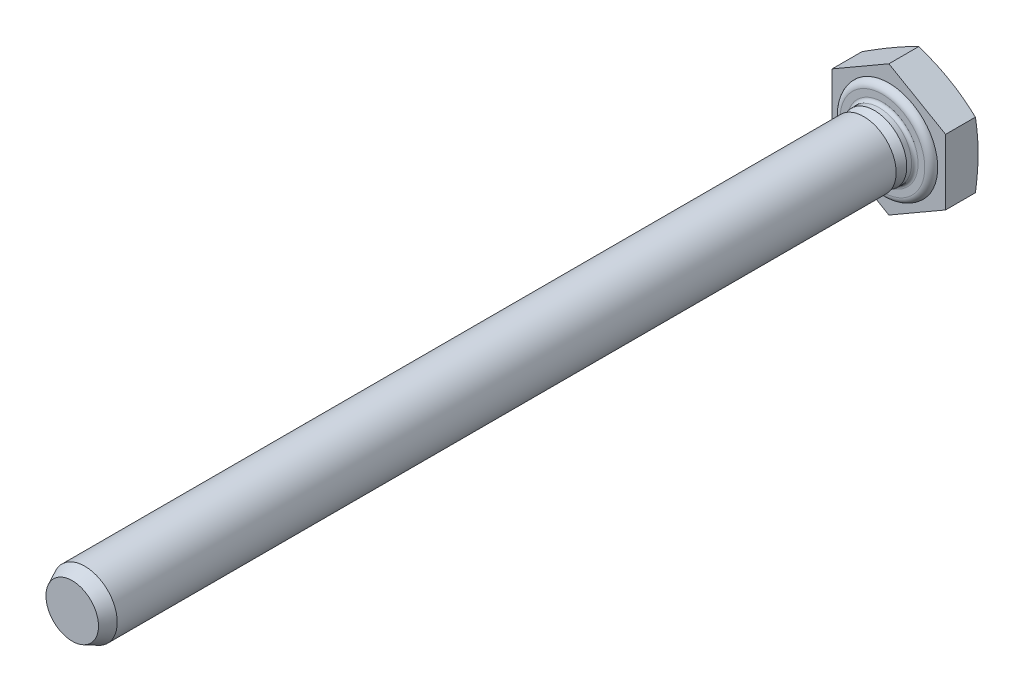
ISO-10303-21;
HEADER;
FILE_DESCRIPTION(('STEP AP214'),'2;1');
FILE_NAME('part.step','',(''),(''),'','','');
FILE_SCHEMA(('AUTOMOTIVE_DESIGN { 1 0 10303 214 1 1 1 1 }'));
ENDSEC;
DATA;
#1=APPLICATION_CONTEXT('core data for automotive mechanical design processes');
#2=APPLICATION_PROTOCOL_DEFINITION('international standard','automotive_design',2000,#1);
#3=PRODUCT_CONTEXT('',#1,'mechanical');
#4=PRODUCT('Part','Part','',(#3));
#5=PRODUCT_RELATED_PRODUCT_CATEGORY('part','',(#4));
#6=PRODUCT_DEFINITION_FORMATION('','',#4);
#7=PRODUCT_DEFINITION_CONTEXT('part definition',#1,'design');
#8=PRODUCT_DEFINITION('design','',#6,#7);
#9=PRODUCT_DEFINITION_SHAPE('','',#8);
#10=(LENGTH_UNIT() NAMED_UNIT(*) SI_UNIT(.MILLI.,.METRE.));
#11=(NAMED_UNIT(*) PLANE_ANGLE_UNIT() SI_UNIT($,.RADIAN.));
#12=(NAMED_UNIT(*) SI_UNIT($,.STERADIAN.) SOLID_ANGLE_UNIT());
#13=UNCERTAINTY_MEASURE_WITH_UNIT(LENGTH_MEASURE(1.E-05),#10,'distance_accuracy_value','');
#14=(GEOMETRIC_REPRESENTATION_CONTEXT(3) GLOBAL_UNCERTAINTY_ASSIGNED_CONTEXT((#13)) GLOBAL_UNIT_ASSIGNED_CONTEXT((#10,
#11,#12)) REPRESENTATION_CONTEXT('',''));
#15=CARTESIAN_POINT('',(0.,0.,0.));
#16=DIRECTION('',(0.,0.,1.));
#17=DIRECTION('',(1.,0.,0.));
#18=AXIS2_PLACEMENT_3D('',#15,#16,#17);
#19=CARTESIAN_POINT('',(-3.5,2.02125,-0.4));
#20=DIRECTION('',(1.,0.,0.));
#21=DIRECTION('',(0.,0.,1.));
#22=AXIS2_PLACEMENT_3D('',#19,#20,#21);
#23=PLANE('',#22);
#24=CARTESIAN_POINT('',(-3.5,5.3488604351927,-1.51685516034737));
#25=CARTESIAN_POINT('',(-3.5,5.1901334809816,-1.55771033626342));
#26=CARTESIAN_POINT('',(-3.5,5.03127797574728,-1.59807472901864));
#27=CARTESIAN_POINT('',(-3.5,4.71324571180039,-1.67755433073894));
#28=CARTESIAN_POINT('',(-3.5,4.55406893563082,-1.71666946976782));
#29=CARTESIAN_POINT('',(-3.5,4.23514159447463,-1.79342792637736));
#30=CARTESIAN_POINT('',(-3.5,4.07539055363853,-1.83106927491527));
#31=CARTESIAN_POINT('',(-3.5,3.75545564883947,-1.90446094500796));
#32=CARTESIAN_POINT('',(-3.5,3.5952717896129,-1.94021128716886));
#33=CARTESIAN_POINT('',(-3.5,3.27610705237593,-2.00899531505113));
#34=CARTESIAN_POINT('',(-3.5,3.11713160670768,-2.04205394501232));
#35=CARTESIAN_POINT('',(-3.5,2.7986140398166,-2.10531078946568));
#36=CARTESIAN_POINT('',(-3.5,2.63907190140448,-2.13550891640915));
#37=CARTESIAN_POINT('',(-3.5,2.15952944957669,-2.22080398148974));
#38=CARTESIAN_POINT('',(-3.5,1.83852497948265,-2.27062132514266));
#39=CARTESIAN_POINT('',(-3.5,1.35261807743886,-2.33003918376043));
#40=CARTESIAN_POINT('',(-3.5,1.18865846372142,-2.34736510986881));
#41=CARTESIAN_POINT('',(-3.5,0.860190119686767,-2.37575426839559));
#42=CARTESIAN_POINT('',(-3.5,0.695681407493685,-2.3868177055038));
#43=CARTESIAN_POINT('',(-3.5,0.366440728396435,-2.40201078206987));
#44=CARTESIAN_POINT('',(-3.5,0.20170896406224,-2.4061447310359));
#45=CARTESIAN_POINT('',(-3.5,-0.127778580974478,-2.40721534738604));
#46=CARTESIAN_POINT('',(-3.5,-0.292534361663439,-2.40415201881899));
#47=CARTESIAN_POINT('',(-3.5,-0.622551935412411,-2.3910026505355));
#48=CARTESIAN_POINT('',(-3.5,-0.787812359146802,-2.38088295800902));
#49=CARTESIAN_POINT('',(-3.5,-1.11780883528591,-2.35421492762463));
#50=CARTESIAN_POINT('',(-3.5,-1.28254487077088,-2.33766638441319));
#51=CARTESIAN_POINT('',(-3.5,-1.61150319670439,-2.29899947625407));
#52=CARTESIAN_POINT('',(-3.5,-1.77572488637315,-2.27687607791194));
#53=CARTESIAN_POINT('',(-3.5,-2.10346813873797,-2.22799486272768));
#54=CARTESIAN_POINT('',(-3.5,-2.26698969906591,-2.20123703022262));
#55=CARTESIAN_POINT('',(-3.5,-2.73266309718323,-2.11953462536887));
#56=CARTESIAN_POINT('',(-3.5,-3.03400993776105,-2.06002556986455));
#57=CARTESIAN_POINT('',(-3.5,-3.63489477991335,-1.93248977248264));
#58=CARTESIAN_POINT('',(-3.5,-3.9344324874207,-1.86446168295884));
#59=CARTESIAN_POINT('',(-3.5,-4.53222161454428,-1.72270275391119));
#60=CARTESIAN_POINT('',(-3.5,-4.83047270674187,-1.64897054387348));
#61=CARTESIAN_POINT('',(-3.5,-5.42595929913076,-1.49763199495027));
#62=CARTESIAN_POINT('',(-3.5,-5.72319487238417,-1.42002594132076));
#63=CARTESIAN_POINT('',(-3.5,-6.31308964580027,-1.26311448110605));
#64=CARTESIAN_POINT('',(-3.5,-6.60575821193297,-1.18384415628839));
#65=CARTESIAN_POINT('',(-3.5,-7.19057265545113,-1.02337751084096));
#66=CARTESIAN_POINT('',(-3.5,-7.48271852072608,-0.942181146192407));
#67=CARTESIAN_POINT('',(-3.5,-8.06617892623189,-0.778484827257806));
#68=CARTESIAN_POINT('',(-3.5,-8.35749405704399,-0.695986973591982));
#69=CARTESIAN_POINT('',(-3.5,-8.93979888292255,-0.529894976544645));
#70=CARTESIAN_POINT('',(-3.5,-9.23078859088742,-0.446300878415219));
#71=CARTESIAN_POINT('',(-3.5,-9.52166450301079,-0.362317231529198));
#72=B_SPLINE_CURVE_WITH_KNOTS('',3,(#24,#25,#26,#27,#28,#29,#30,#31,#32,#33,#34,#35,#36,#37,#38,
#39,#40,#41,#42,#43,#44,#45,#46,#47,#48,#49,#50,#51,#52,#53,#54,#55,#56,#57,#58,#59,#60,#61,#62,
#63,#64,#65,#66,#67,#68,#69,#70,#71),.UNSPECIFIED.,.F.,.F.,(4,2,2,2,2,2,2,2,2,2,2,2,2,2,2,2,2,2,
2,2,2,2,2,4),(0.,0.491704059994914,0.983435598679787,1.47580312849893,1.96816529192506,
2.45526698050728,2.94238357253472,3.91634600186475,4.41086669666165,4.90537122708709,
5.39956810664278,5.89376470818666,6.39033446930134,6.88692009339614,7.38395568856989,
7.88099296359977,8.80227509527502,9.72370315129692,10.645353288099,11.5669356577118,
12.4765685300994,13.3862222118088,14.2945334630867,15.2028073372995),.UNSPECIFIED.);
#73=CARTESIAN_POINT('',(-3.5,-0.392200705129955,-2.4));
#74=VERTEX_POINT('',#73);
#75=CARTESIAN_POINT('',(-3.5,-2.02125,-2.24006354118505));
#76=VERTEX_POINT('',#75);
#77=EDGE_CURVE('E188',#74,#76,#72,.T.);
#78=ORIENTED_EDGE('',*,*,#77,.T.);
#79=DIRECTION('',(0.,0.,-1.));
#80=VECTOR('',#79,1.);
#81=CARTESIAN_POINT('',(-3.5,-2.02125,-0.400000000000001));
#82=LINE('',#81,#80);
#83=CARTESIAN_POINT('',(-3.5,-2.02125,-0.400000000000001));
#84=VERTEX_POINT('',#83);
#85=EDGE_CURVE('E354',#84,#76,#82,.T.);
#86=ORIENTED_EDGE('',*,*,#85,.F.);
#87=DIRECTION('',(0.,-1.,0.));
#88=VECTOR('',#87,1.);
#89=CARTESIAN_POINT('',(-3.5,-2.02125,-0.400000000000001));
#90=LINE('',#89,#88);
#91=CARTESIAN_POINT('',(-3.5,2.02125,-0.400000000000001));
#92=VERTEX_POINT('',#91);
#93=EDGE_CURVE('E159',#92,#84,#90,.T.);
#94=ORIENTED_EDGE('',*,*,#93,.F.);
#95=DIRECTION('',(0.,0.,-1.));
#96=VECTOR('',#95,1.);
#97=CARTESIAN_POINT('',(-3.5,2.02125,-0.400000000000001));
#98=LINE('',#97,#96);
#99=CARTESIAN_POINT('',(-3.5,2.02125,-2.24006354118505));
#100=VERTEX_POINT('',#99);
#101=EDGE_CURVE('E363',#92,#100,#98,.T.);
#102=ORIENTED_EDGE('',*,*,#101,.T.);
#103=CARTESIAN_POINT('',(-3.5,0.392200705129954,-2.4));
#104=VERTEX_POINT('',#103);
#105=EDGE_CURVE('E402',#100,#104,#72,.T.);
#106=ORIENTED_EDGE('',*,*,#105,.T.);
#107=DIRECTION('',(0.,-1.,0.));
#108=VECTOR('',#107,1.);
#109=CARTESIAN_POINT('',(-3.5,2.02125,-2.4));
#110=LINE('',#109,#108);
#111=EDGE_CURVE('E409',#104,#74,#110,.T.);
#112=ORIENTED_EDGE('',*,*,#111,.T.);
#113=EDGE_LOOP('',(#78,#86,#94,#102,#106,#112));
#114=FACE_BOUND('',#113,.T.);
#115=ADVANCED_FACE('F40',(#114),#23,.F.);
#116=CARTESIAN_POINT('',(-3.5,-2.02125,-0.4));
#117=DIRECTION('',(0.500097243556191,0.865969252911153,0.));
#118=DIRECTION('',(-0.865969252911153,0.500097243556191,0.));
#119=AXIS2_PLACEMENT_3D('',#116,#117,#118);
#120=PLANE('',#119);
#121=CARTESIAN_POINT('',(-1.41640070076157,-3.2245285953102,-2.400002));
#122=CARTESIAN_POINT('',(-1.29772681498736,-3.2930627643448,-2.39540691595689));
#123=CARTESIAN_POINT('',(-1.17913739968787,-3.36154815168026,-2.38832977609456));
#124=CARTESIAN_POINT('',(-0.942331358140242,-3.49830364067401,-2.36964316794344));
#125=CARTESIAN_POINT('',(-0.8241144931643,-3.56657388019762,-2.35803776387308));
#126=CARTESIAN_POINT('',(-0.588065368071718,-3.70289224993858,-2.33071907533163));
#127=CARTESIAN_POINT('',(-0.470233043693961,-3.77094041726674,-2.31500651699555));
#128=CARTESIAN_POINT('',(-0.234860755951052,-3.90686791343827,-2.27998236582985));
#129=CARTESIAN_POINT('',(-0.117321149585182,-3.97474703611456,-2.26066755771633));
#130=CARTESIAN_POINT('',(1.99999999983532E-06,-4.042501155,-2.23982132755722));
#131=B_SPLINE_CURVE_WITH_KNOTS('',3,(#121,#122,#123,#124,#125,#126,#127,#128,#129,#130),
.UNSPECIFIED.,.F.,.F.,(4,2,2,2,4),(0.,0.411313414061384,0.822258511167226,1.23313100325125,
1.6443720010649),.UNSPECIFIED.);
#132=CARTESIAN_POINT('',(-1.41634934798408,-3.22455825153919,-2.4));
#133=VERTEX_POINT('',#132);
#134=CARTESIAN_POINT('',(-0.00136154217500548,-4.04171370939394,-2.24006354118505));
#135=VERTEX_POINT('',#134);
#136=EDGE_CURVE('E63',#133,#135,#131,.T.);
#137=ORIENTED_EDGE('',*,*,#136,.T.);
#138=DIRECTION('',(0.865969252911153,-0.500097243556191,0.));
#139=VECTOR('',#138,1.);
#140=CARTESIAN_POINT('',(0.,-4.0425,-2.24006354118505));
#141=LINE('',#140,#139);
#142=CARTESIAN_POINT('',(0.,-4.0425,-2.24006354118505));
#143=VERTEX_POINT('',#142);
#144=EDGE_CURVE('E167',#135,#143,#141,.T.);
#145=ORIENTED_EDGE('',*,*,#144,.T.);
#146=DIRECTION('',(0.,0.,-1.));
#147=VECTOR('',#146,1.);
#148=CARTESIAN_POINT('',(0.,-4.0425,-0.400000000000001));
#149=LINE('',#148,#147);
#150=CARTESIAN_POINT('',(0.,-4.0425,-0.400000000000001));
#151=VERTEX_POINT('',#150);
#152=EDGE_CURVE('E148',#151,#143,#149,.T.);
#153=ORIENTED_EDGE('',*,*,#152,.F.);
#154=DIRECTION('',(0.865969252911153,-0.500097243556191,0.));
#155=VECTOR('',#154,1.);
#156=CARTESIAN_POINT('',(0.,-4.0425,-0.400000000000001));
#157=LINE('',#156,#155);
#158=EDGE_CURVE('E154',#84,#151,#157,.T.);
#159=ORIENTED_EDGE('',*,*,#158,.F.);
#160=ORIENTED_EDGE('',*,*,#85,.T.);
#161=CARTESIAN_POINT('',(-3.500002,-2.021248845,-2.24006318601753));
#162=CARTESIAN_POINT('',(-3.3827907951511,-2.08893831580024,-2.2608774043366));
#163=CARTESIAN_POINT('',(-3.26536355220382,-2.1567525486023,-2.28016212696227));
#164=CARTESIAN_POINT('',(-3.03021657496527,-2.29254992795756,-2.31513158850531));
#165=CARTESIAN_POINT('',(-2.91249719639175,-2.36053286908377,-2.33081953307972));
#166=CARTESIAN_POINT('',(-2.67667488596115,-2.49672025335744,-2.35809597220863));
#167=CARTESIAN_POINT('',(-2.5585718901785,-2.56492473342192,-2.36968374397391));
#168=CARTESIAN_POINT('',(-2.32199446100164,-2.70154819877155,-2.38834343332547));
#169=CARTESIAN_POINT('',(-2.20351978978409,-2.76996732139969,-2.39541130021978));
#170=CARTESIAN_POINT('',(-2.08496084141342,-2.83843511408375,-2.400002));
#171=B_SPLINE_CURVE_WITH_KNOTS('',3,(#161,#162,#163,#164,#165,#166,#167,#168,#169,#170),
.UNSPECIFIED.,.F.,.F.,(4,2,2,2,4),(0.,0.410843033009391,0.821318462999757,1.23186621666674,
1.64278138526766),.UNSPECIFIED.);
#172=CARTESIAN_POINT('',(-2.08501219419092,-2.83840545785474,-2.4));
#173=VERTEX_POINT('',#172);
#174=EDGE_CURVE('E178',#76,#173,#171,.T.);
#175=ORIENTED_EDGE('',*,*,#174,.T.);
#176=DIRECTION('',(0.865969252911153,-0.500097243556191,0.));
#177=VECTOR('',#176,1.);
#178=CARTESIAN_POINT('',(-3.5,-2.02125,-2.4));
#179=LINE('',#178,#177);
#180=EDGE_CURVE('E415',#173,#133,#179,.T.);
#181=ORIENTED_EDGE('',*,*,#180,.T.);
#182=EDGE_LOOP('',(#137,#145,#153,#159,#160,#175,#181));
#183=FACE_BOUND('',#182,.T.);
#184=ADVANCED_FACE('F165',(#183),#120,.F.);
#185=CARTESIAN_POINT('',(0.,-4.0425,-0.4));
#186=DIRECTION('',(-0.500097243556191,0.865969252911153,0.));
#187=DIRECTION('',(-0.865969252911153,-0.500097243556191,0.));
#188=AXIS2_PLACEMENT_3D('',#185,#186,#187);
#189=PLANE('',#188);
#190=CARTESIAN_POINT('',(2.08496084141342,-2.83843511408375,-2.400002));
#191=CARTESIAN_POINT('',(2.20351978978409,-2.76996732139969,-2.39541130021978));
#192=CARTESIAN_POINT('',(2.32199446100164,-2.70154819877155,-2.38834343332547));
#193=CARTESIAN_POINT('',(2.5585718901785,-2.56492473342192,-2.36968374397391));
#194=CARTESIAN_POINT('',(2.67667488596115,-2.49672025335744,-2.35809597220863));
#195=CARTESIAN_POINT('',(2.91249719639175,-2.36053286908377,-2.33081953307973));
#196=CARTESIAN_POINT('',(3.03021657496527,-2.29254992795756,-2.31513158850531));
#197=CARTESIAN_POINT('',(3.26536355220381,-2.1567525486023,-2.28016212696227));
#198=CARTESIAN_POINT('',(3.3827907951511,-2.08893831580024,-2.2608774043366));
#199=CARTESIAN_POINT('',(3.500002,-2.021248845,-2.24006318601753));
#200=B_SPLINE_CURVE_WITH_KNOTS('',3,(#190,#191,#192,#193,#194,#195,#196,#197,#198,#199),
.UNSPECIFIED.,.F.,.F.,(4,2,2,2,4),(0.,0.410915168600916,0.821462922267904,1.23193835225827,
1.64278138526766),.UNSPECIFIED.);
#201=CARTESIAN_POINT('',(2.08501219419091,-2.83840545785475,-2.4));
#202=VERTEX_POINT('',#201);
#203=CARTESIAN_POINT('',(3.5,-2.02125,-2.24006354118505));
#204=VERTEX_POINT('',#203);
#205=EDGE_CURVE('E237',#202,#204,#200,.T.);
#206=ORIENTED_EDGE('',*,*,#205,.T.);
#207=DIRECTION('',(0.,0.,-1.));
#208=VECTOR('',#207,1.);
#209=CARTESIAN_POINT('',(3.5,-2.02125,-0.400000000000001));
#210=LINE('',#209,#208);
#211=CARTESIAN_POINT('',(3.5,-2.02125,-0.400000000000001));
#212=VERTEX_POINT('',#211);
#213=EDGE_CURVE('E150',#212,#204,#210,.T.);
#214=ORIENTED_EDGE('',*,*,#213,.F.);
#215=DIRECTION('',(0.865969252911153,0.500097243556191,0.));
#216=VECTOR('',#215,1.);
#217=CARTESIAN_POINT('',(3.5,-2.02125,-0.400000000000001));
#218=LINE('',#217,#216);
#219=EDGE_CURVE('E142',#151,#212,#218,.T.);
#220=ORIENTED_EDGE('',*,*,#219,.F.);
#221=ORIENTED_EDGE('',*,*,#152,.T.);
#222=DIRECTION('',(0.865969252911153,0.500097243556191,0.));
#223=VECTOR('',#222,1.);
#224=CARTESIAN_POINT('',(3.5,-2.02125,-2.24006354118505));
#225=LINE('',#224,#223);
#226=CARTESIAN_POINT('',(0.00136154217500375,-4.04171370939394,-2.24006354118505));
#227=VERTEX_POINT('',#226);
#228=EDGE_CURVE('E356',#143,#227,#225,.T.);
#229=ORIENTED_EDGE('',*,*,#228,.T.);
#230=CARTESIAN_POINT('',(-2.0000000004417E-06,-4.042501155,-2.23982132755722));
#231=CARTESIAN_POINT('',(0.117321149585182,-3.97474703611456,-2.26066755771633));
#232=CARTESIAN_POINT('',(0.234860755951053,-3.90686791343827,-2.27998236582985));
#233=CARTESIAN_POINT('',(0.470233043693963,-3.77094041726674,-2.31500651699555));
#234=CARTESIAN_POINT('',(0.588065368071721,-3.70289224993858,-2.33071907533163));
#235=CARTESIAN_POINT('',(0.824114493164304,-3.56657388019761,-2.35803776387308));
#236=CARTESIAN_POINT('',(0.942331358140246,-3.49830364067401,-2.36964316794344));
#237=CARTESIAN_POINT('',(1.17913739968788,-3.36154815168025,-2.38832977609456));
#238=CARTESIAN_POINT('',(1.29772681498737,-3.29306276434479,-2.39540691595689));
#239=CARTESIAN_POINT('',(1.41640070076158,-3.22452859531019,-2.400002));
#240=B_SPLINE_CURVE_WITH_KNOTS('',3,(#230,#231,#232,#233,#234,#235,#236,#237,#238,#239),
.UNSPECIFIED.,.F.,.F.,(4,2,2,2,4),(0.,0.411240997813655,0.822113489897677,1.23305858700352,
1.64437200106491),.UNSPECIFIED.);
#241=CARTESIAN_POINT('',(1.41634934798408,-3.22455825153919,-2.4));
#242=VERTEX_POINT('',#241);
#243=EDGE_CURVE('E217',#227,#242,#240,.T.);
#244=ORIENTED_EDGE('',*,*,#243,.T.);
#245=DIRECTION('',(0.865969252911153,0.500097243556191,0.));
#246=VECTOR('',#245,1.);
#247=CARTESIAN_POINT('',(0.,-4.0425,-2.4));
#248=LINE('',#247,#246);
#249=EDGE_CURVE('E432',#242,#202,#248,.T.);
#250=ORIENTED_EDGE('',*,*,#249,.T.);
#251=EDGE_LOOP('',(#206,#214,#220,#221,#229,#244,#250));
#252=FACE_BOUND('',#251,.T.);
#253=ADVANCED_FACE('F145',(#252),#189,.F.);
#254=CARTESIAN_POINT('',(3.5,-2.02125,-0.4));
#255=DIRECTION('',(-1.,0.,0.));
#256=DIRECTION('',(0.,0.,-1.));
#257=AXIS2_PLACEMENT_3D('',#254,#255,#256);
#258=PLANE('',#257);
#259=CARTESIAN_POINT('',(3.5,5.34886045272993,-1.51685515583218));
#260=CARTESIAN_POINT('',(3.5,5.19013349781647,-1.55771033196912));
#261=CARTESIAN_POINT('',(3.5,5.03127799187948,-1.59807472494449));
#262=CARTESIAN_POINT('',(3.5,4.71324572652607,-1.67755432710199));
#263=CARTESIAN_POINT('',(3.5,4.55406894965266,-1.71666946634792));
#264=CARTESIAN_POINT('',(3.5,4.23514160708411,-1.79342792338765));
#265=CARTESIAN_POINT('',(3.5,4.07539056553948,-1.83106927213868));
#266=CARTESIAN_POINT('',(3.5,3.75545565932112,-1.90446094265012));
#267=CARTESIAN_POINT('',(3.5,3.59527179938376,-1.94021128501667));
#268=CARTESIAN_POINT('',(3.5,3.27610706074698,-2.00899531329304));
#269=CARTESIAN_POINT('',(3.5,3.1171316143898,-2.04205394344304));
#270=CARTESIAN_POINT('',(3.5,2.79861404611691,-2.10531078825801));
#271=CARTESIAN_POINT('',(3.5,2.63907190701193,-2.13550891537428));
#272=CARTESIAN_POINT('',(3.5,2.15952945309904,-2.22080398093847));
#273=CARTESIAN_POINT('',(3.5,1.83852498160459,-2.27062132486781));
#274=CARTESIAN_POINT('',(3.5,1.35261807734071,-2.33003918378021));
#275=CARTESIAN_POINT('',(3.5,1.18865846281182,-2.34736510996943));
#276=CARTESIAN_POINT('',(3.5,0.860190117149437,-2.37575426859289));
#277=CARTESIAN_POINT('',(3.5,0.695681404140076,-2.38681770571695));
#278=CARTESIAN_POINT('',(3.5,0.366440723410655,-2.40201078224164));
#279=CARTESIAN_POINT('',(3.5,0.20170895826057,-2.40614473115054));
#280=CARTESIAN_POINT('',(3.5,-0.127778588403958,-2.4072153473144));
#281=CARTESIAN_POINT('',(3.5,-0.292534369904838,-2.40415201861822));
#282=CARTESIAN_POINT('',(3.5,-0.62255194527725,-2.39100265001414));
#283=CARTESIAN_POINT('',(3.5,-0.787812369823112,-2.38088295729576));
#284=CARTESIAN_POINT('',(3.5,-1.11780884757554,-2.35421492648179));
#285=CARTESIAN_POINT('',(3.5,-1.28254488386236,-2.33766638303268));
#286=CARTESIAN_POINT('',(3.5,-1.61150321139349,-2.29899947436879));
#287=CARTESIAN_POINT('',(3.5,-1.77572490185802,-2.27687607575946));
#288=CARTESIAN_POINT('',(3.5,-2.10346815580746,-2.22799486002503));
#289=CARTESIAN_POINT('',(3.5,-2.26698971692425,-2.201237027237));
#290=CARTESIAN_POINT('',(3.5,-2.73266311578358,-2.11953462183004));
#291=CARTESIAN_POINT('',(3.5,-3.03400995632021,-2.06002556611146));
#292=CARTESIAN_POINT('',(3.5,-3.63489479840001,-1.93248976837338));
#293=CARTESIAN_POINT('',(3.5,-3.93443250587606,-1.86446167870772));
#294=CARTESIAN_POINT('',(3.5,-4.53222163293786,-1.72270274942423));
#295=CARTESIAN_POINT('',(3.5,-4.830472725105,-1.6489705392927));
#296=CARTESIAN_POINT('',(3.5,-5.42595931743994,-1.49763199021128));
#297=CARTESIAN_POINT('',(3.5,-5.72319489066982,-1.42002593651737));
#298=CARTESIAN_POINT('',(3.5,-6.31308966401444,-1.26311447620144));
#299=CARTESIAN_POINT('',(3.5,-6.60575823009919,-1.18384415134697));
#300=CARTESIAN_POINT('',(3.5,-7.19057267352456,-1.02337750583872));
#301=CARTESIAN_POINT('',(3.5,-7.48271853875468,-0.94218114116616));
#302=CARTESIAN_POINT('',(3.5,-8.06617894418693,-0.77848482218837));
#303=CARTESIAN_POINT('',(3.5,-8.35749407497028,-0.695986968503292));
#304=CARTESIAN_POINT('',(3.5,-8.93979890079322,-0.529894971423545));
#305=CARTESIAN_POINT('',(3.5,-9.2307886087312,-0.446300873280962));
#306=CARTESIAN_POINT('',(3.5,-9.52166452082823,-0.36231722638368));
#307=B_SPLINE_CURVE_WITH_KNOTS('',3,(#259,#260,#261,#262,#263,#264,#265,#266,#267,#268,#269,
#270,#271,#272,#273,#274,#275,#276,#277,#278,#279,#280,#281,#282,#283,#284,#285,#286,#287,#288,
#289,#290,#291,#292,#293,#294,#295,#296,#297,#298,#299,#300,#301,#302,#303,#304,#305,#306),
.UNSPECIFIED.,.F.,.F.,(4,2,2,2,2,2,2,2,2,2,2,2,2,2,2,2,2,2,2,2,2,2,2,4),(0.,0.491704062200663,
0.983435603091438,1.4758031351261,1.96816530076773,2.45526699148858,2.94238358565485,
3.9163460192572,4.41086671649894,4.9053712493687,5.39956813136456,5.89376473534879,
6.39033449892696,6.8869201254857,7.3839557231321,7.88099300063454,8.8022751323168,
9.7237031883425,10.645353325124,11.5669356947177,12.4765685669954,13.3862222485946,
14.2945334998053,15.2028073739514),.UNSPECIFIED.);
#308=CARTESIAN_POINT('',(3.5,0.392200705129943,-2.4));
#309=VERTEX_POINT('',#308);
#310=CARTESIAN_POINT('',(3.5,2.02125,-2.24006354118505));
#311=VERTEX_POINT('',#310);
#312=EDGE_CURVE('E377',#309,#311,#307,.F.);
#313=ORIENTED_EDGE('',*,*,#312,.T.);
#314=DIRECTION('',(0.,0.,-1.));
#315=VECTOR('',#314,1.);
#316=CARTESIAN_POINT('',(3.5,2.02125,-0.400000000000001));
#317=LINE('',#316,#315);
#318=CARTESIAN_POINT('',(3.5,2.02125,-0.400000000000001));
#319=VERTEX_POINT('',#318);
#320=EDGE_CURVE('E172',#319,#311,#317,.T.);
#321=ORIENTED_EDGE('',*,*,#320,.F.);
#322=DIRECTION('',(0.,1.,0.));
#323=VECTOR('',#322,1.);
#324=CARTESIAN_POINT('',(3.5,2.02125,-0.400000000000001));
#325=LINE('',#324,#323);
#326=EDGE_CURVE('E153',#212,#319,#325,.T.);
#327=ORIENTED_EDGE('',*,*,#326,.F.);
#328=ORIENTED_EDGE('',*,*,#213,.T.);
#329=CARTESIAN_POINT('',(3.5,-0.392200705129944,-2.4));
#330=VERTEX_POINT('',#329);
#331=EDGE_CURVE('E230',#204,#330,#307,.F.);
#332=ORIENTED_EDGE('',*,*,#331,.T.);
#333=DIRECTION('',(0.,1.,0.));
#334=VECTOR('',#333,1.);
#335=CARTESIAN_POINT('',(3.5,-2.02125,-2.4));
#336=LINE('',#335,#334);
#337=EDGE_CURVE('E380',#330,#309,#336,.T.);
#338=ORIENTED_EDGE('',*,*,#337,.T.);
#339=EDGE_LOOP('',(#313,#321,#327,#328,#332,#338));
#340=FACE_BOUND('',#339,.T.);
#341=ADVANCED_FACE('F274',(#340),#258,.F.);
#342=CARTESIAN_POINT('',(3.5,2.02125,-0.4));
#343=DIRECTION('',(-0.500097243556191,-0.865969252911153,0.));
#344=DIRECTION('',(0.865969252911153,-0.500097243556191,0.));
#345=AXIS2_PLACEMENT_3D('',#342,#343,#344);
#346=PLANE('',#345);
#347=CARTESIAN_POINT('',(1.41640070076158,3.22452859531019,-2.400002));
#348=CARTESIAN_POINT('',(1.29772681498737,3.29306276434479,-2.39540691595689));
#349=CARTESIAN_POINT('',(1.17913739968788,3.36154815168025,-2.38832977609456));
#350=CARTESIAN_POINT('',(0.942331358140246,3.49830364067401,-2.36964316794344));
#351=CARTESIAN_POINT('',(0.824114493164304,3.56657388019761,-2.35803776387308));
#352=CARTESIAN_POINT('',(0.588065368071721,3.70289224993858,-2.33071907533163));
#353=CARTESIAN_POINT('',(0.470233043693963,3.77094041726674,-2.31500651699555));
#354=CARTESIAN_POINT('',(0.234860755951053,3.90686791343827,-2.27998236582985));
#355=CARTESIAN_POINT('',(0.117321149585183,3.97474703611456,-2.26066755771633));
#356=CARTESIAN_POINT('',(-1.99999999904323E-06,4.042501155,-2.23982132755722));
#357=B_SPLINE_CURVE_WITH_KNOTS('',3,(#347,#348,#349,#350,#351,#352,#353,#354,#355,#356),
.UNSPECIFIED.,.F.,.F.,(4,2,2,2,4),(0.,0.411313414061386,0.822258511167229,1.23313100325125,
1.6443720010649),.UNSPECIFIED.);
#358=CARTESIAN_POINT('',(1.41634934798408,3.22455825153919,-2.4));
#359=VERTEX_POINT('',#358);
#360=CARTESIAN_POINT('',(0.00136154217500268,4.04171370939394,-2.24006354118505));
#361=VERTEX_POINT('',#360);
#362=EDGE_CURVE('E257',#359,#361,#357,.T.);
#363=ORIENTED_EDGE('',*,*,#362,.T.);
#364=DIRECTION('',(-0.865969252911153,0.500097243556191,0.));
#365=VECTOR('',#364,1.);
#366=CARTESIAN_POINT('',(0.,4.0425,-2.24006354118505));
#367=LINE('',#366,#365);
#368=CARTESIAN_POINT('',(0.,4.0425,-2.24006354118505));
#369=VERTEX_POINT('',#368);
#370=EDGE_CURVE('E358',#361,#369,#367,.T.);
#371=ORIENTED_EDGE('',*,*,#370,.T.);
#372=DIRECTION('',(0.,0.,-1.));
#373=VECTOR('',#372,1.);
#374=CARTESIAN_POINT('',(0.,4.0425,-0.400000000000001));
#375=LINE('',#374,#373);
#376=CARTESIAN_POINT('',(0.,4.0425,-0.400000000000001));
#377=VERTEX_POINT('',#376);
#378=EDGE_CURVE('E366',#377,#369,#375,.T.);
#379=ORIENTED_EDGE('',*,*,#378,.F.);
#380=DIRECTION('',(-0.865969252911153,0.500097243556191,0.));
#381=VECTOR('',#380,1.);
#382=CARTESIAN_POINT('',(0.,4.0425,-0.400000000000001));
#383=LINE('',#382,#381);
#384=EDGE_CURVE('E349',#319,#377,#383,.T.);
#385=ORIENTED_EDGE('',*,*,#384,.F.);
#386=ORIENTED_EDGE('',*,*,#320,.T.);
#387=CARTESIAN_POINT('',(3.500002,2.021248845,-2.24006318601753));
#388=CARTESIAN_POINT('',(3.3827907951511,2.08893831580024,-2.2608774043366));
#389=CARTESIAN_POINT('',(3.26536355220381,2.1567525486023,-2.28016212696227));
#390=CARTESIAN_POINT('',(3.03021657496527,2.29254992795756,-2.31513158850531));
#391=CARTESIAN_POINT('',(2.91249719639175,2.36053286908377,-2.33081953307973));
#392=CARTESIAN_POINT('',(2.67667488596115,2.49672025335744,-2.35809597220863));
#393=CARTESIAN_POINT('',(2.5585718901785,2.56492473342192,-2.36968374397392));
#394=CARTESIAN_POINT('',(2.32199446100164,2.70154819877155,-2.38834343332547));
#395=CARTESIAN_POINT('',(2.20351978978409,2.76996732139969,-2.39541130021978));
#396=CARTESIAN_POINT('',(2.08496084141342,2.83843511408375,-2.400002));
#397=B_SPLINE_CURVE_WITH_KNOTS('',3,(#387,#388,#389,#390,#391,#392,#393,#394,#395,#396),
.UNSPECIFIED.,.F.,.F.,(4,2,2,2,4),(0.,0.410843033009392,0.821318462999759,1.23186621666675,
1.64278138526766),.UNSPECIFIED.);
#398=CARTESIAN_POINT('',(2.08501219419091,2.83840545785475,-2.4));
#399=VERTEX_POINT('',#398);
#400=EDGE_CURVE('E244',#311,#399,#397,.T.);
#401=ORIENTED_EDGE('',*,*,#400,.T.);
#402=DIRECTION('',(-0.865969252911153,0.500097243556191,0.));
#403=VECTOR('',#402,1.);
#404=CARTESIAN_POINT('',(3.5,2.02125,-2.4));
#405=LINE('',#404,#403);
#406=EDGE_CURVE('E465',#399,#359,#405,.T.);
#407=ORIENTED_EDGE('',*,*,#406,.T.);
#408=EDGE_LOOP('',(#363,#371,#379,#385,#386,#401,#407));
#409=FACE_BOUND('',#408,.T.);
#410=ADVANCED_FACE('F270',(#409),#346,.F.);
#411=CARTESIAN_POINT('',(0.,4.0425,-0.4));
#412=DIRECTION('',(0.500097243556191,-0.865969252911153,0.));
#413=DIRECTION('',(0.865969252911153,0.500097243556191,0.));
#414=AXIS2_PLACEMENT_3D('',#411,#412,#413);
#415=PLANE('',#414);
#416=CARTESIAN_POINT('',(-2.08496084141343,2.83843511408374,-2.400002));
#417=CARTESIAN_POINT('',(-2.2035197897841,2.76996732139968,-2.39541130021978));
#418=CARTESIAN_POINT('',(-2.32199446100165,2.70154819877155,-2.38834343332547));
#419=CARTESIAN_POINT('',(-2.5585718901785,2.56492473342191,-2.36968374397391));
#420=CARTESIAN_POINT('',(-2.67667488596115,2.49672025335743,-2.35809597220863));
#421=CARTESIAN_POINT('',(-2.91249719639175,2.36053286908376,-2.33081953307973));
#422=CARTESIAN_POINT('',(-3.03021657496527,2.29254992795755,-2.31513158850531));
#423=CARTESIAN_POINT('',(-3.26536355220382,2.1567525486023,-2.28016212696227));
#424=CARTESIAN_POINT('',(-3.3827907951511,2.08893831580024,-2.2608774043366));
#425=CARTESIAN_POINT('',(-3.500002,2.021248845,-2.24006318601753));
#426=B_SPLINE_CURVE_WITH_KNOTS('',3,(#416,#417,#418,#419,#420,#421,#422,#423,#424,#425),
.UNSPECIFIED.,.F.,.F.,(4,2,2,2,4),(0.,0.410915168600914,0.821462922267898,1.23193835225826,
1.64278138526765),.UNSPECIFIED.);
#427=CARTESIAN_POINT('',(-2.08501219419092,2.83840545785474,-2.4));
#428=VERTEX_POINT('',#427);
#429=EDGE_CURVE('E263',#428,#100,#426,.T.);
#430=ORIENTED_EDGE('',*,*,#429,.T.);
#431=ORIENTED_EDGE('',*,*,#101,.F.);
#432=DIRECTION('',(-0.865969252911153,-0.500097243556191,0.));
#433=VECTOR('',#432,1.);
#434=CARTESIAN_POINT('',(-3.5,2.02125,-0.400000000000001));
#435=LINE('',#434,#433);
#436=EDGE_CURVE('E351',#377,#92,#435,.T.);
#437=ORIENTED_EDGE('',*,*,#436,.F.);
#438=ORIENTED_EDGE('',*,*,#378,.T.);
#439=DIRECTION('',(-0.865969252911153,-0.500097243556191,0.));
#440=VECTOR('',#439,1.);
#441=CARTESIAN_POINT('',(-3.5,2.02125,-2.24006354118505));
#442=LINE('',#441,#440);
#443=CARTESIAN_POINT('',(-0.00136154217500353,4.04171370939394,-2.24006354118505));
#444=VERTEX_POINT('',#443);
#445=EDGE_CURVE('E163',#369,#444,#442,.T.);
#446=ORIENTED_EDGE('',*,*,#445,.T.);
#447=CARTESIAN_POINT('',(2.00000000079563E-06,4.042501155,-2.23982132755722));
#448=CARTESIAN_POINT('',(-0.117321149585181,3.97474703611456,-2.26066755771633));
#449=CARTESIAN_POINT('',(-0.234860755951052,3.90686791343827,-2.27998236582985));
#450=CARTESIAN_POINT('',(-0.470233043693961,3.77094041726674,-2.31500651699555));
#451=CARTESIAN_POINT('',(-0.588065368071719,3.70289224993858,-2.33071907533163));
#452=CARTESIAN_POINT('',(-0.824114493164301,3.56657388019762,-2.35803776387308));
#453=CARTESIAN_POINT('',(-0.942331358140243,3.49830364067401,-2.36964316794344));
#454=CARTESIAN_POINT('',(-1.17913739968787,3.36154815168025,-2.38832977609456));
#455=CARTESIAN_POINT('',(-1.29772681498737,3.2930627643448,-2.39540691595689));
#456=CARTESIAN_POINT('',(-1.41640070076157,3.22452859531019,-2.400002));
#457=B_SPLINE_CURVE_WITH_KNOTS('',3,(#447,#448,#449,#450,#451,#452,#453,#454,#455,#456),
.UNSPECIFIED.,.F.,.F.,(4,2,2,2,4),(0.,0.411240997813653,0.822113489897674,1.23305858700352,
1.6443720010649),.UNSPECIFIED.);
#458=CARTESIAN_POINT('',(-1.41634934798408,3.22455825153919,-2.4));
#459=VERTEX_POINT('',#458);
#460=EDGE_CURVE('E251',#444,#459,#457,.T.);
#461=ORIENTED_EDGE('',*,*,#460,.T.);
#462=DIRECTION('',(-0.865969252911153,-0.500097243556191,0.));
#463=VECTOR('',#462,1.);
#464=CARTESIAN_POINT('',(0.,4.0425,-2.4));
#465=LINE('',#464,#463);
#466=EDGE_CURVE('E424',#459,#428,#465,.T.);
#467=ORIENTED_EDGE('',*,*,#466,.T.);
#468=EDGE_LOOP('',(#430,#431,#437,#438,#446,#461,#467));
#469=FACE_BOUND('',#468,.T.);
#470=ADVANCED_FACE('F273',(#469),#415,.F.);
#471=CARTESIAN_POINT('',(0.,0.,-2.21494545454545));
#472=DIRECTION('',(0.,0.,1.));
#473=DIRECTION('',(-1.,0.,0.));
#474=AXIS2_PLACEMENT_3D('',#471,#472,#473);
#475=CONICAL_SURFACE('',#474,4.12335,1.27230524444207);
#476=CARTESIAN_POINT('',(0.,0.,-2.24006354118505));
#477=DIRECTION('',(0.,0.,1.));
#478=DIRECTION('',(1.,0.,0.));
#479=AXIS2_PLACEMENT_3D('',#476,#477,#478);
#480=CIRCLE('',#479,4.04171393872698);
#481=EDGE_CURVE('E170',#135,#227,#480,.T.);
#482=ORIENTED_EDGE('',*,*,#481,.F.);
#483=ORIENTED_EDGE('',*,*,#136,.F.);
#484=CARTESIAN_POINT('',(0.,0.,-2.4));
#485=DIRECTION('',(0.,0.,1.));
#486=DIRECTION('',(-1.,0.,0.));
#487=AXIS2_PLACEMENT_3D('',#484,#485,#486);
#488=CIRCLE('',#487,3.52190593189319);
#489=EDGE_CURVE('E430',#242,#133,#488,.F.);
#490=ORIENTED_EDGE('',*,*,#489,.F.);
#491=ORIENTED_EDGE('',*,*,#243,.F.);
#492=EDGE_LOOP('',(#482,#483,#490,#491));
#493=FACE_BOUND('',#492,.T.);
#494=ADVANCED_FACE('F206',(#493),#475,.T.);
#495=CARTESIAN_POINT('',(0.,0.,-2.24006354118505));
#496=DIRECTION('',(0.,0.,1.));
#497=DIRECTION('',(1.,0.,0.));
#498=AXIS2_PLACEMENT_3D('',#495,#496,#497);
#499=CIRCLE('',#498,4.04171393872698);
#500=EDGE_CURVE('E55',#361,#444,#499,.T.);
#501=ORIENTED_EDGE('',*,*,#500,.F.);
#502=ORIENTED_EDGE('',*,*,#362,.F.);
#503=EDGE_CURVE('E317',#459,#359,#488,.F.);
#504=ORIENTED_EDGE('',*,*,#503,.F.);
#505=ORIENTED_EDGE('',*,*,#460,.F.);
#506=EDGE_LOOP('',(#501,#502,#504,#505));
#507=FACE_BOUND('',#506,.T.);
#508=ADVANCED_FACE('F596',(#507),#475,.T.);
#509=CARTESIAN_POINT('',(-3.5,-2.02125,-2.4));
#510=DIRECTION('',(0.,0.,1.));
#511=DIRECTION('',(-1.,0.,0.));
#512=AXIS2_PLACEMENT_3D('',#509,#510,#511);
#513=PLANE('',#512);
#514=ORIENTED_EDGE('',*,*,#111,.F.);
#515=EDGE_CURVE('E312',#104,#428,#488,.F.);
#516=ORIENTED_EDGE('',*,*,#515,.T.);
#517=ORIENTED_EDGE('',*,*,#466,.F.);
#518=ORIENTED_EDGE('',*,*,#503,.T.);
#519=ORIENTED_EDGE('',*,*,#406,.F.);
#520=EDGE_CURVE('E581',#399,#309,#488,.F.);
#521=ORIENTED_EDGE('',*,*,#520,.T.);
#522=ORIENTED_EDGE('',*,*,#337,.F.);
#523=EDGE_CURVE('E576',#330,#202,#488,.F.);
#524=ORIENTED_EDGE('',*,*,#523,.T.);
#525=ORIENTED_EDGE('',*,*,#249,.F.);
#526=ORIENTED_EDGE('',*,*,#489,.T.);
#527=ORIENTED_EDGE('',*,*,#180,.F.);
#528=EDGE_CURVE('E319',#173,#74,#488,.F.);
#529=ORIENTED_EDGE('',*,*,#528,.T.);
#530=EDGE_LOOP('',(#514,#516,#517,#518,#519,#521,#522,#524,#525,#526,#527,#529));
#531=FACE_BOUND('',#530,.T.);
#532=ADVANCED_FACE('F209',(#531),#513,.F.);
#533=ORIENTED_EDGE('',*,*,#528,.F.);
#534=ORIENTED_EDGE('',*,*,#174,.F.);
#535=ORIENTED_EDGE('',*,*,#77,.F.);
#536=EDGE_LOOP('',(#533,#534,#535));
#537=FACE_BOUND('',#536,.T.);
#538=ADVANCED_FACE('F207',(#537),#475,.T.);
#539=ORIENTED_EDGE('',*,*,#523,.F.);
#540=ORIENTED_EDGE('',*,*,#331,.F.);
#541=ORIENTED_EDGE('',*,*,#205,.F.);
#542=EDGE_LOOP('',(#539,#540,#541));
#543=FACE_BOUND('',#542,.T.);
#544=ADVANCED_FACE('F603',(#543),#475,.T.);
#545=ORIENTED_EDGE('',*,*,#520,.F.);
#546=ORIENTED_EDGE('',*,*,#400,.F.);
#547=ORIENTED_EDGE('',*,*,#312,.F.);
#548=EDGE_LOOP('',(#545,#546,#547));
#549=FACE_BOUND('',#548,.T.);
#550=ADVANCED_FACE('F204',(#549),#475,.T.);
#551=ORIENTED_EDGE('',*,*,#429,.F.);
#552=ORIENTED_EDGE('',*,*,#515,.F.);
#553=ORIENTED_EDGE('',*,*,#105,.F.);
#554=EDGE_LOOP('',(#551,#552,#553));
#555=FACE_BOUND('',#554,.T.);
#556=ADVANCED_FACE('F198',(#555),#475,.T.);
#557=CARTESIAN_POINT('',(0.,0.,-2.24006354118505));
#558=DIRECTION('',(0.,0.,-1.));
#559=DIRECTION('',(-1.,0.,0.));
#560=AXIS2_PLACEMENT_3D('',#557,#558,#559);
#561=PLANE('',#560);
#562=ORIENTED_EDGE('',*,*,#481,.T.);
#563=ORIENTED_EDGE('',*,*,#228,.F.);
#564=ORIENTED_EDGE('',*,*,#144,.F.);
#565=EDGE_LOOP('',(#562,#563,#564));
#566=FACE_BOUND('',#565,.T.);
#567=ADVANCED_FACE('F203',(#566),#561,.T.);
#568=ORIENTED_EDGE('',*,*,#500,.T.);
#569=ORIENTED_EDGE('',*,*,#445,.F.);
#570=ORIENTED_EDGE('',*,*,#370,.F.);
#571=EDGE_LOOP('',(#568,#569,#570));
#572=FACE_BOUND('',#571,.T.);
#573=ADVANCED_FACE('F595',(#572),#561,.T.);
#574=CARTESIAN_POINT('',(0.,0.,-0.400000000000001));
#575=DIRECTION('',(0.,0.,-1.));
#576=DIRECTION('',(-1.,0.,0.));
#577=AXIS2_PLACEMENT_3D('',#574,#575,#576);
#578=PLANE('',#577);
#579=CARTESIAN_POINT('',(0.,0.,-0.400000000000005));
#580=DIRECTION('',(0.,0.,-1.));
#581=DIRECTION('',(-1.,0.,0.));
#582=AXIS2_PLACEMENT_3D('',#579,#580,#581);
#583=CIRCLE('',#582,3.015);
#584=CARTESIAN_POINT('',(-3.015,0.,-0.400000000000005));
#585=VERTEX_POINT('',#584);
#586=EDGE_CURVE('E335',#585,#585,#583,.T.);
#587=ORIENTED_EDGE('',*,*,#586,.T.);
#588=EDGE_LOOP('',(#587));
#589=FACE_BOUND('',#588,.T.);
#590=ORIENTED_EDGE('',*,*,#158,.T.);
#591=ORIENTED_EDGE('',*,*,#219,.T.);
#592=ORIENTED_EDGE('',*,*,#326,.T.);
#593=ORIENTED_EDGE('',*,*,#384,.T.);
#594=ORIENTED_EDGE('',*,*,#436,.T.);
#595=ORIENTED_EDGE('',*,*,#93,.T.);
#596=EDGE_LOOP('',(#590,#591,#592,#593,#594,#595));
#597=FACE_BOUND('',#596,.T.);
#598=ADVANCED_FACE('F157',(#589,#597),#578,.F.);
#599=CARTESIAN_POINT('',(0.,0.,50.));
#600=DIRECTION('',(0.,0.,-1.));
#601=DIRECTION('',(-1.,0.,0.));
#602=AXIS2_PLACEMENT_3D('',#599,#600,#601);
#603=CYLINDRICAL_SURFACE('',#602,2.);
#604=CARTESIAN_POINT('',(0.,0.,49.221125));
#605=DIRECTION('',(0.,0.,1.));
#606=DIRECTION('',(1.,0.,0.));
#607=AXIS2_PLACEMENT_3D('',#604,#605,#606);
#608=CIRCLE('',#607,2.);
#609=CARTESIAN_POINT('',(2.,0.,49.221125));
#610=VERTEX_POINT('',#609);
#611=EDGE_CURVE('E310',#610,#610,#608,.F.);
#612=ORIENTED_EDGE('',*,*,#611,.T.);
#613=EDGE_LOOP('',(#612));
#614=FACE_BOUND('',#613,.T.);
#615=CARTESIAN_POINT('',(0.,0.,1.152));
#616=DIRECTION('',(0.,0.,-1.));
#617=DIRECTION('',(-1.,0.,0.));
#618=AXIS2_PLACEMENT_3D('',#615,#616,#617);
#619=CIRCLE('',#618,2.);
#620=CARTESIAN_POINT('',(-2.,0.,1.152));
#621=VERTEX_POINT('',#620);
#622=EDGE_CURVE('E345',#621,#621,#619,.T.);
#623=ORIENTED_EDGE('',*,*,#622,.F.);
#624=EDGE_LOOP('',(#623));
#625=FACE_BOUND('',#624,.T.);
#626=ADVANCED_FACE('F711',(#614,#625),#603,.T.);
#627=CARTESIAN_POINT('',(1.621125,0.,1.152));
#628=DIRECTION('',(0.,0.,-1.));
#629=DIRECTION('',(-1.,0.,0.));
#630=AXIS2_PLACEMENT_3D('',#627,#628,#629);
#631=PLANE('',#630);
#632=ORIENTED_EDGE('',*,*,#622,.T.);
#633=EDGE_LOOP('',(#632));
#634=FACE_BOUND('',#633,.T.);
#635=CARTESIAN_POINT('',(0.,0.,1.152));
#636=DIRECTION('',(0.,0.,-1.));
#637=DIRECTION('',(-1.,0.,0.));
#638=AXIS2_PLACEMENT_3D('',#635,#636,#637);
#639=CIRCLE('',#638,1.621125);
#640=CARTESIAN_POINT('',(-1.621125,0.,1.152));
#641=VERTEX_POINT('',#640);
#642=EDGE_CURVE('E338',#641,#641,#639,.T.);
#643=ORIENTED_EDGE('',*,*,#642,.F.);
#644=EDGE_LOOP('',(#643));
#645=FACE_BOUND('',#644,.T.);
#646=ADVANCED_FACE('F718',(#634,#645),#631,.T.);
#647=CARTESIAN_POINT('',(0.,0.,0.495769250282344));
#648=DIRECTION('',(0.,0.,-1.));
#649=DIRECTION('',(-1.,0.,0.));
#650=AXIS2_PLACEMENT_3D('',#647,#648,#649);
#651=CONICAL_SURFACE('',#650,2.,0.5235987755983);
#652=ORIENTED_EDGE('',*,*,#642,.T.);
#653=EDGE_LOOP('',(#652));
#654=FACE_BOUND('',#653,.T.);
#655=CARTESIAN_POINT('',(0.,0.,0.495769250282344));
#656=DIRECTION('',(0.,0.,-1.));
#657=DIRECTION('',(-1.,0.,0.));
#658=AXIS2_PLACEMENT_3D('',#655,#656,#657);
#659=CIRCLE('',#658,2.);
#660=CARTESIAN_POINT('',(-2.,0.,0.495769250282343));
#661=VERTEX_POINT('',#660);
#662=EDGE_CURVE('E334',#661,#661,#659,.T.);
#663=ORIENTED_EDGE('',*,*,#662,.F.);
#664=EDGE_LOOP('',(#663));
#665=FACE_BOUND('',#664,.T.);
#666=ADVANCED_FACE('F723',(#654,#665),#651,.T.);
#667=CARTESIAN_POINT('',(0.,0.,50.));
#668=DIRECTION('',(0.,0.,-1.));
#669=DIRECTION('',(-1.,0.,0.));
#670=AXIS2_PLACEMENT_3D('',#667,#668,#669);
#671=CYLINDRICAL_SURFACE('',#670,2.);
#672=CARTESIAN_POINT('',(0.,0.,0.199999999999999));
#673=DIRECTION('',(0.,0.,1.));
#674=DIRECTION('',(1.,0.,0.));
#675=AXIS2_PLACEMENT_3D('',#672,#673,#674);
#676=CIRCLE('',#675,2.);
#677=CARTESIAN_POINT('',(2.,0.,0.199999999999999));
#678=VERTEX_POINT('',#677);
#679=EDGE_CURVE('E12',#678,#678,#676,.T.);
#680=ORIENTED_EDGE('',*,*,#679,.T.);
#681=EDGE_LOOP('',(#680));
#682=FACE_BOUND('',#681,.T.);
#683=ORIENTED_EDGE('',*,*,#662,.T.);
#684=EDGE_LOOP('',(#683));
#685=FACE_BOUND('',#684,.T.);
#686=ADVANCED_FACE('F328',(#682,#685),#671,.T.);
#687=CARTESIAN_POINT('',(2.615,0.,0.));
#688=DIRECTION('',(0.,0.,1.));
#689=DIRECTION('',(1.,0.,0.));
#690=AXIS2_PLACEMENT_3D('',#687,#688,#689);
#691=PLANE('',#690);
#692=CARTESIAN_POINT('',(0.,0.,0.));
#693=DIRECTION('',(0.,0.,1.));
#694=DIRECTION('',(1.,0.,0.));
#695=AXIS2_PLACEMENT_3D('',#692,#693,#694);
#696=CIRCLE('',#695,2.2);
#697=CARTESIAN_POINT('',(2.2,0.,0.));
#698=VERTEX_POINT('',#697);
#699=EDGE_CURVE('E48',#698,#698,#696,.F.);
#700=ORIENTED_EDGE('',*,*,#699,.T.);
#701=EDGE_LOOP('',(#700));
#702=FACE_BOUND('',#701,.T.);
#703=CARTESIAN_POINT('',(0.,0.,0.));
#704=DIRECTION('',(0.,0.,-1.));
#705=DIRECTION('',(-1.,0.,0.));
#706=AXIS2_PLACEMENT_3D('',#703,#704,#705);
#707=CIRCLE('',#706,2.615);
#708=CARTESIAN_POINT('',(-2.615,0.,0.));
#709=VERTEX_POINT('',#708);
#710=EDGE_CURVE('E332',#709,#709,#707,.T.);
#711=ORIENTED_EDGE('',*,*,#710,.F.);
#712=EDGE_LOOP('',(#711));
#713=FACE_BOUND('',#712,.T.);
#714=ADVANCED_FACE('F324',(#702,#713),#691,.T.);
#715=CARTESIAN_POINT('',(0.,0.,-0.4));
#716=DIRECTION('',(0.,0.,-1.));
#717=DIRECTION('',(-1.,0.,0.));
#718=AXIS2_PLACEMENT_3D('',#715,#716,#717);
#719=TOROIDAL_SURFACE('',#718,2.615,0.4);
#720=ORIENTED_EDGE('',*,*,#710,.T.);
#721=EDGE_LOOP('',(#720));
#722=FACE_BOUND('',#721,.T.);
#723=ORIENTED_EDGE('',*,*,#586,.F.);
#724=EDGE_LOOP('',(#723));
#725=FACE_BOUND('',#724,.T.);
#726=ADVANCED_FACE('F301',(#722,#725),#719,.T.);
#727=CARTESIAN_POINT('',(2.,0.,50.));
#728=DIRECTION('',(0.,0.,1.));
#729=DIRECTION('',(1.,0.,0.));
#730=AXIS2_PLACEMENT_3D('',#727,#728,#729);
#731=PLANE('',#730);
#732=CARTESIAN_POINT('',(0.,0.,50.));
#733=DIRECTION('',(0.,0.,1.));
#734=DIRECTION('',(1.,0.,0.));
#735=AXIS2_PLACEMENT_3D('',#732,#733,#734);
#736=CIRCLE('',#735,1.62112499999999);
#737=CARTESIAN_POINT('',(1.62112499999999,0.,50.));
#738=VERTEX_POINT('',#737);
#739=EDGE_CURVE('E307',#738,#738,#736,.T.);
#740=ORIENTED_EDGE('',*,*,#739,.T.);
#741=EDGE_LOOP('',(#740));
#742=FACE_BOUND('',#741,.T.);
#743=ADVANCED_FACE('F294',(#742),#731,.T.);
#744=CARTESIAN_POINT('',(0.,0.,49.221125));
#745=DIRECTION('',(0.,0.,-1.));
#746=DIRECTION('',(-1.,0.,0.));
#747=AXIS2_PLACEMENT_3D('',#744,#745,#746);
#748=CONICAL_SURFACE('',#747,2.,0.452739889546851);
#749=ORIENTED_EDGE('',*,*,#739,.F.);
#750=EDGE_LOOP('',(#749));
#751=FACE_BOUND('',#750,.T.);
#752=ORIENTED_EDGE('',*,*,#611,.F.);
#753=EDGE_LOOP('',(#752));
#754=FACE_BOUND('',#753,.T.);
#755=ADVANCED_FACE('F292',(#751,#754),#748,.T.);
#756=CARTESIAN_POINT('',(0.,0.,0.199999999999999));
#757=DIRECTION('',(0.,0.,1.));
#758=DIRECTION('',(1.,0.,0.));
#759=AXIS2_PLACEMENT_3D('',#756,#757,#758);
#760=TOROIDAL_SURFACE('',#759,2.2,0.2);
#761=ORIENTED_EDGE('',*,*,#679,.F.);
#762=EDGE_LOOP('',(#761));
#763=FACE_BOUND('',#762,.T.);
#764=ORIENTED_EDGE('',*,*,#699,.F.);
#765=EDGE_LOOP('',(#764));
#766=FACE_BOUND('',#765,.T.);
#767=ADVANCED_FACE('F42',(#763,#766),#760,.F.);
#768=CLOSED_SHELL('',(#115,#184,#253,#341,#410,#470,#494,#508,#532,#538,#544,#550,#556,#567,
#573,#598,#626,#646,#666,#686,#714,#726,#743,#755,#767));
#769=MANIFOLD_SOLID_BREP('B2',#768);
#770=ADVANCED_BREP_SHAPE_REPRESENTATION('',(#18,#769),#14);
#771=SHAPE_DEFINITION_REPRESENTATION(#9,#770);
ENDSEC;
END-ISO-10303-21;
